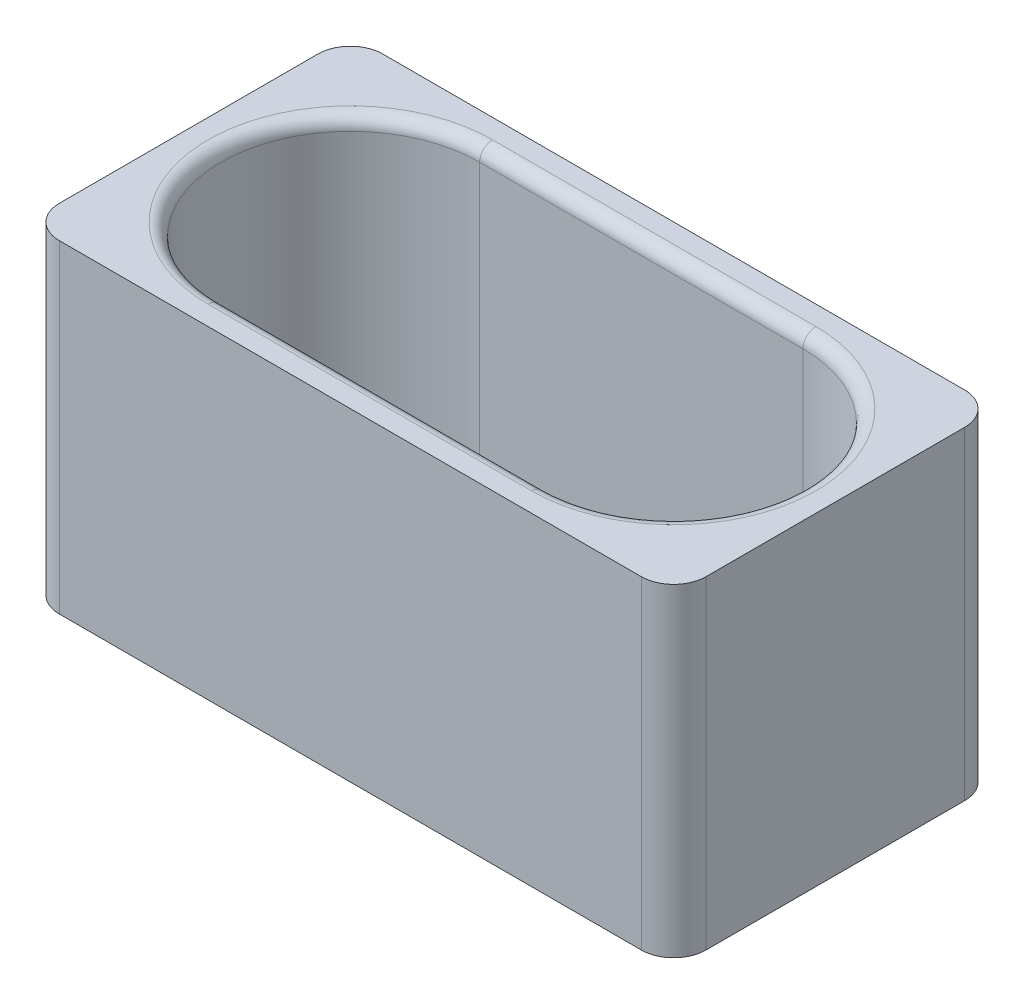
ISO-10303-21;
HEADER;
FILE_DESCRIPTION(('STEP AP214'),'2;1');
FILE_NAME('part.step','',(''),(''),'','','');
FILE_SCHEMA(('AUTOMOTIVE_DESIGN { 1 0 10303 214 1 1 1 1 }'));
ENDSEC;
DATA;
#1=APPLICATION_CONTEXT('core data for automotive mechanical design processes');
#2=APPLICATION_PROTOCOL_DEFINITION('international standard','automotive_design',2000,#1);
#3=PRODUCT_CONTEXT('',#1,'mechanical');
#4=PRODUCT('Part','Part','',(#3));
#5=PRODUCT_RELATED_PRODUCT_CATEGORY('part','',(#4));
#6=PRODUCT_DEFINITION_FORMATION('','',#4);
#7=PRODUCT_DEFINITION_CONTEXT('part definition',#1,'design');
#8=PRODUCT_DEFINITION('design','',#6,#7);
#9=PRODUCT_DEFINITION_SHAPE('','',#8);
#10=(LENGTH_UNIT() NAMED_UNIT(*) SI_UNIT(.MILLI.,.METRE.));
#11=(NAMED_UNIT(*) PLANE_ANGLE_UNIT() SI_UNIT($,.RADIAN.));
#12=(NAMED_UNIT(*) SI_UNIT($,.STERADIAN.) SOLID_ANGLE_UNIT());
#13=UNCERTAINTY_MEASURE_WITH_UNIT(LENGTH_MEASURE(1.E-05),#10,'distance_accuracy_value','');
#14=(GEOMETRIC_REPRESENTATION_CONTEXT(3) GLOBAL_UNCERTAINTY_ASSIGNED_CONTEXT((#13)) GLOBAL_UNIT_ASSIGNED_CONTEXT((#10,
#11,#12)) REPRESENTATION_CONTEXT('',''));
#15=CARTESIAN_POINT('',(0.,0.,0.));
#16=DIRECTION('',(0.,0.,1.));
#17=DIRECTION('',(1.,0.,0.));
#18=AXIS2_PLACEMENT_3D('',#15,#16,#17);
#19=CARTESIAN_POINT('',(50.,50.,25.));
#20=DIRECTION('',(-1.,0.,0.));
#21=DIRECTION('',(0.,0.,1.));
#22=AXIS2_PLACEMENT_3D('',#19,#20,#21);
#23=PLANE('',#22);
#24=DIRECTION('',(0.,0.,-1.));
#25=VECTOR('',#24,1.);
#26=CARTESIAN_POINT('',(50.,0.,25.));
#27=LINE('',#26,#25);
#28=CARTESIAN_POINT('',(50.,0.,20.));
#29=VERTEX_POINT('',#28);
#30=CARTESIAN_POINT('',(50.,0.,-20.));
#31=VERTEX_POINT('',#30);
#32=EDGE_CURVE('E178',#29,#31,#27,.T.);
#33=ORIENTED_EDGE('',*,*,#32,.T.);
#34=DIRECTION('',(0.,-1.,0.));
#35=VECTOR('',#34,1.);
#36=CARTESIAN_POINT('',(50.,50.,-20.));
#37=LINE('',#36,#35);
#38=CARTESIAN_POINT('',(50.,50.,-20.));
#39=VERTEX_POINT('',#38);
#40=EDGE_CURVE('E155',#31,#39,#37,.F.);
#41=ORIENTED_EDGE('',*,*,#40,.T.);
#42=DIRECTION('',(0.,0.,-1.));
#43=VECTOR('',#42,1.);
#44=CARTESIAN_POINT('',(50.,50.,25.));
#45=LINE('',#44,#43);
#46=CARTESIAN_POINT('',(50.,50.,20.));
#47=VERTEX_POINT('',#46);
#48=EDGE_CURVE('E189',#47,#39,#45,.T.);
#49=ORIENTED_EDGE('',*,*,#48,.F.);
#50=DIRECTION('',(0.,-1.,0.));
#51=VECTOR('',#50,1.);
#52=CARTESIAN_POINT('',(50.,50.,20.));
#53=LINE('',#52,#51);
#54=EDGE_CURVE('E160',#47,#29,#53,.T.);
#55=ORIENTED_EDGE('',*,*,#54,.T.);
#56=EDGE_LOOP('',(#33,#41,#49,#55));
#57=FACE_BOUND('',#56,.T.);
#58=ADVANCED_FACE('F34',(#57),#23,.F.);
#59=CARTESIAN_POINT('',(-50.,50.,-25.));
#60=DIRECTION('',(0.,0.,1.));
#61=DIRECTION('',(1.,0.,0.));
#62=AXIS2_PLACEMENT_3D('',#59,#60,#61);
#63=PLANE('',#62);
#64=DIRECTION('',(-1.,0.,0.));
#65=VECTOR('',#64,1.);
#66=CARTESIAN_POINT('',(-50.,50.,-25.));
#67=LINE('',#66,#65);
#68=CARTESIAN_POINT('',(45.,50.,-25.));
#69=VERTEX_POINT('',#68);
#70=CARTESIAN_POINT('',(-45.,50.,-25.));
#71=VERTEX_POINT('',#70);
#72=EDGE_CURVE('E170',#69,#71,#67,.T.);
#73=ORIENTED_EDGE('',*,*,#72,.F.);
#74=DIRECTION('',(0.,-1.,0.));
#75=VECTOR('',#74,1.);
#76=CARTESIAN_POINT('',(45.,50.,-25.));
#77=LINE('',#76,#75);
#78=CARTESIAN_POINT('',(45.,0.,-25.));
#79=VERTEX_POINT('',#78);
#80=EDGE_CURVE('E154',#69,#79,#77,.T.);
#81=ORIENTED_EDGE('',*,*,#80,.T.);
#82=DIRECTION('',(-1.,0.,0.));
#83=VECTOR('',#82,1.);
#84=CARTESIAN_POINT('',(-50.,0.,-25.));
#85=LINE('',#84,#83);
#86=CARTESIAN_POINT('',(-45.,0.,-25.));
#87=VERTEX_POINT('',#86);
#88=EDGE_CURVE('E167',#79,#87,#85,.T.);
#89=ORIENTED_EDGE('',*,*,#88,.T.);
#90=DIRECTION('',(0.,-1.,0.));
#91=VECTOR('',#90,1.);
#92=CARTESIAN_POINT('',(-45.,50.,-25.));
#93=LINE('',#92,#91);
#94=EDGE_CURVE('E172',#87,#71,#93,.F.);
#95=ORIENTED_EDGE('',*,*,#94,.T.);
#96=EDGE_LOOP('',(#73,#81,#89,#95));
#97=FACE_BOUND('',#96,.T.);
#98=ADVANCED_FACE('F166',(#97),#63,.F.);
#99=CARTESIAN_POINT('',(-50.,50.,25.));
#100=DIRECTION('',(1.,0.,0.));
#101=DIRECTION('',(0.,0.,-1.));
#102=AXIS2_PLACEMENT_3D('',#99,#100,#101);
#103=PLANE('',#102);
#104=DIRECTION('',(0.,0.,1.));
#105=VECTOR('',#104,1.);
#106=CARTESIAN_POINT('',(-50.,50.,25.));
#107=LINE('',#106,#105);
#108=CARTESIAN_POINT('',(-50.,50.,-20.));
#109=VERTEX_POINT('',#108);
#110=CARTESIAN_POINT('',(-50.,50.,20.));
#111=VERTEX_POINT('',#110);
#112=EDGE_CURVE('E319',#109,#111,#107,.T.);
#113=ORIENTED_EDGE('',*,*,#112,.F.);
#114=DIRECTION('',(0.,-1.,0.));
#115=VECTOR('',#114,1.);
#116=CARTESIAN_POINT('',(-50.,50.,-20.));
#117=LINE('',#116,#115);
#118=CARTESIAN_POINT('',(-50.,0.,-20.));
#119=VERTEX_POINT('',#118);
#120=EDGE_CURVE('E213',#109,#119,#117,.T.);
#121=ORIENTED_EDGE('',*,*,#120,.T.);
#122=DIRECTION('',(0.,0.,1.));
#123=VECTOR('',#122,1.);
#124=CARTESIAN_POINT('',(-50.,0.,25.));
#125=LINE('',#124,#123);
#126=CARTESIAN_POINT('',(-50.,0.,20.));
#127=VERTEX_POINT('',#126);
#128=EDGE_CURVE('E177',#119,#127,#125,.T.);
#129=ORIENTED_EDGE('',*,*,#128,.T.);
#130=DIRECTION('',(0.,-1.,0.));
#131=VECTOR('',#130,1.);
#132=CARTESIAN_POINT('',(-50.,50.,20.));
#133=LINE('',#132,#131);
#134=EDGE_CURVE('E211',#127,#111,#133,.F.);
#135=ORIENTED_EDGE('',*,*,#134,.T.);
#136=EDGE_LOOP('',(#113,#121,#129,#135));
#137=FACE_BOUND('',#136,.T.);
#138=ADVANCED_FACE('F340',(#137),#103,.F.);
#139=CARTESIAN_POINT('',(-50.,50.,25.));
#140=DIRECTION('',(0.,0.,-1.));
#141=DIRECTION('',(-1.,0.,0.));
#142=AXIS2_PLACEMENT_3D('',#139,#140,#141);
#143=PLANE('',#142);
#144=DIRECTION('',(1.,0.,0.));
#145=VECTOR('',#144,1.);
#146=CARTESIAN_POINT('',(-50.,0.,25.));
#147=LINE('',#146,#145);
#148=CARTESIAN_POINT('',(-45.,0.,25.));
#149=VERTEX_POINT('',#148);
#150=CARTESIAN_POINT('',(45.,0.,25.));
#151=VERTEX_POINT('',#150);
#152=EDGE_CURVE('E181',#149,#151,#147,.T.);
#153=ORIENTED_EDGE('',*,*,#152,.T.);
#154=DIRECTION('',(0.,-1.,0.));
#155=VECTOR('',#154,1.);
#156=CARTESIAN_POINT('',(45.,50.,25.));
#157=LINE('',#156,#155);
#158=CARTESIAN_POINT('',(45.,50.,25.));
#159=VERTEX_POINT('',#158);
#160=EDGE_CURVE('E209',#151,#159,#157,.F.);
#161=ORIENTED_EDGE('',*,*,#160,.T.);
#162=DIRECTION('',(1.,0.,0.));
#163=VECTOR('',#162,1.);
#164=CARTESIAN_POINT('',(-50.,50.,25.));
#165=LINE('',#164,#163);
#166=CARTESIAN_POINT('',(-45.,50.,25.));
#167=VERTEX_POINT('',#166);
#168=EDGE_CURVE('E190',#167,#159,#165,.T.);
#169=ORIENTED_EDGE('',*,*,#168,.F.);
#170=DIRECTION('',(0.,-1.,0.));
#171=VECTOR('',#170,1.);
#172=CARTESIAN_POINT('',(-45.,50.,25.));
#173=LINE('',#172,#171);
#174=EDGE_CURVE('E206',#167,#149,#173,.T.);
#175=ORIENTED_EDGE('',*,*,#174,.T.);
#176=EDGE_LOOP('',(#153,#161,#169,#175));
#177=FACE_BOUND('',#176,.T.);
#178=ADVANCED_FACE('F334',(#177),#143,.F.);
#179=CARTESIAN_POINT('',(0.,50.,0.));
#180=DIRECTION('',(0.,-1.,0.));
#181=DIRECTION('',(0.,0.,-1.));
#182=AXIS2_PLACEMENT_3D('',#179,#180,#181);
#183=PLANE('',#182);
#184=CARTESIAN_POINT('',(-25.,50.,0.));
#185=DIRECTION('',(0.,-1.,0.));
#186=DIRECTION('',(0.,0.,-1.));
#187=AXIS2_PLACEMENT_3D('',#184,#185,#186);
#188=CIRCLE('',#187,22.);
#189=CARTESIAN_POINT('',(-25.,50.,22.));
#190=VERTEX_POINT('',#189);
#191=CARTESIAN_POINT('',(-25.,50.,-22.));
#192=VERTEX_POINT('',#191);
#193=EDGE_CURVE('E251',#190,#192,#188,.T.);
#194=ORIENTED_EDGE('',*,*,#193,.T.);
#195=DIRECTION('',(-1.,0.,0.));
#196=VECTOR('',#195,1.);
#197=CARTESIAN_POINT('',(0.,50.,-22.));
#198=LINE('',#197,#196);
#199=CARTESIAN_POINT('',(25.,50.,-22.));
#200=VERTEX_POINT('',#199);
#201=EDGE_CURVE('E256',#192,#200,#198,.F.);
#202=ORIENTED_EDGE('',*,*,#201,.T.);
#203=CARTESIAN_POINT('',(25.,50.,0.));
#204=DIRECTION('',(0.,-1.,0.));
#205=DIRECTION('',(0.,0.,-1.));
#206=AXIS2_PLACEMENT_3D('',#203,#204,#205);
#207=CIRCLE('',#206,22.);
#208=CARTESIAN_POINT('',(25.,50.,22.));
#209=VERTEX_POINT('',#208);
#210=EDGE_CURVE('E58',#200,#209,#207,.T.);
#211=ORIENTED_EDGE('',*,*,#210,.T.);
#212=DIRECTION('',(1.,0.,0.));
#213=VECTOR('',#212,1.);
#214=CARTESIAN_POINT('',(0.,50.,22.));
#215=LINE('',#214,#213);
#216=EDGE_CURVE('E253',#209,#190,#215,.F.);
#217=ORIENTED_EDGE('',*,*,#216,.T.);
#218=EDGE_LOOP('',(#194,#202,#211,#217));
#219=FACE_BOUND('',#218,.T.);
#220=ORIENTED_EDGE('',*,*,#48,.T.);
#221=CARTESIAN_POINT('',(45.,50.,-20.));
#222=DIRECTION('',(0.,-1.,0.));
#223=DIRECTION('',(0.,0.,-1.));
#224=AXIS2_PLACEMENT_3D('',#221,#222,#223);
#225=CIRCLE('',#224,5.);
#226=EDGE_CURVE('E204',#39,#69,#225,.F.);
#227=ORIENTED_EDGE('',*,*,#226,.T.);
#228=ORIENTED_EDGE('',*,*,#72,.T.);
#229=CARTESIAN_POINT('',(-45.,50.,-20.));
#230=DIRECTION('',(0.,-1.,0.));
#231=DIRECTION('',(0.,0.,-1.));
#232=AXIS2_PLACEMENT_3D('',#229,#230,#231);
#233=CIRCLE('',#232,5.);
#234=EDGE_CURVE('E200',#71,#109,#233,.F.);
#235=ORIENTED_EDGE('',*,*,#234,.T.);
#236=ORIENTED_EDGE('',*,*,#112,.T.);
#237=CARTESIAN_POINT('',(-45.,50.,20.));
#238=DIRECTION('',(0.,-1.,0.));
#239=DIRECTION('',(0.,0.,-1.));
#240=AXIS2_PLACEMENT_3D('',#237,#238,#239);
#241=CIRCLE('',#240,5.);
#242=EDGE_CURVE('E198',#111,#167,#241,.F.);
#243=ORIENTED_EDGE('',*,*,#242,.T.);
#244=ORIENTED_EDGE('',*,*,#168,.T.);
#245=CARTESIAN_POINT('',(45.,50.,20.));
#246=DIRECTION('',(0.,-1.,0.));
#247=DIRECTION('',(0.,0.,-1.));
#248=AXIS2_PLACEMENT_3D('',#245,#246,#247);
#249=CIRCLE('',#248,5.);
#250=EDGE_CURVE('E202',#159,#47,#249,.F.);
#251=ORIENTED_EDGE('',*,*,#250,.T.);
#252=EDGE_LOOP('',(#220,#227,#228,#235,#236,#243,#244,#251));
#253=FACE_BOUND('',#252,.T.);
#254=ADVANCED_FACE('F285',(#219,#253),#183,.F.);
#255=CARTESIAN_POINT('',(0.,0.,0.));
#256=DIRECTION('',(0.,-1.,0.));
#257=DIRECTION('',(0.,0.,-1.));
#258=AXIS2_PLACEMENT_3D('',#255,#256,#257);
#259=PLANE('',#258);
#260=CARTESIAN_POINT('',(25.,0.,0.));
#261=DIRECTION('',(0.,-1.,0.));
#262=DIRECTION('',(0.,0.,-1.));
#263=AXIS2_PLACEMENT_3D('',#260,#261,#262);
#264=CIRCLE('',#263,2.5);
#265=CARTESIAN_POINT('',(25.,0.,-2.5));
#266=VERTEX_POINT('',#265);
#267=EDGE_CURVE('E306',#266,#266,#264,.T.);
#268=ORIENTED_EDGE('',*,*,#267,.F.);
#269=EDGE_LOOP('',(#268));
#270=FACE_BOUND('',#269,.T.);
#271=CARTESIAN_POINT('',(-25.,0.,0.));
#272=DIRECTION('',(0.,-1.,0.));
#273=DIRECTION('',(0.,0.,-1.));
#274=AXIS2_PLACEMENT_3D('',#271,#272,#273);
#275=CIRCLE('',#274,2.5);
#276=CARTESIAN_POINT('',(-25.,0.,-2.5));
#277=VERTEX_POINT('',#276);
#278=EDGE_CURVE('E183',#277,#277,#275,.T.);
#279=ORIENTED_EDGE('',*,*,#278,.F.);
#280=EDGE_LOOP('',(#279));
#281=FACE_BOUND('',#280,.T.);
#282=ORIENTED_EDGE('',*,*,#88,.F.);
#283=CARTESIAN_POINT('',(45.,0.,-20.));
#284=DIRECTION('',(0.,-1.,0.));
#285=DIRECTION('',(0.,0.,-1.));
#286=AXIS2_PLACEMENT_3D('',#283,#284,#285);
#287=CIRCLE('',#286,5.);
#288=EDGE_CURVE('E150',#79,#31,#287,.T.);
#289=ORIENTED_EDGE('',*,*,#288,.T.);
#290=ORIENTED_EDGE('',*,*,#32,.F.);
#291=CARTESIAN_POINT('',(45.,0.,20.));
#292=DIRECTION('',(0.,-1.,0.));
#293=DIRECTION('',(0.,0.,-1.));
#294=AXIS2_PLACEMENT_3D('',#291,#292,#293);
#295=CIRCLE('',#294,5.);
#296=EDGE_CURVE('E161',#29,#151,#295,.T.);
#297=ORIENTED_EDGE('',*,*,#296,.T.);
#298=ORIENTED_EDGE('',*,*,#152,.F.);
#299=CARTESIAN_POINT('',(-45.,0.,20.));
#300=DIRECTION('',(0.,-1.,0.));
#301=DIRECTION('',(0.,0.,-1.));
#302=AXIS2_PLACEMENT_3D('',#299,#300,#301);
#303=CIRCLE('',#302,5.);
#304=EDGE_CURVE('E171',#149,#127,#303,.T.);
#305=ORIENTED_EDGE('',*,*,#304,.T.);
#306=ORIENTED_EDGE('',*,*,#128,.F.);
#307=CARTESIAN_POINT('',(-45.,0.,-20.));
#308=DIRECTION('',(0.,-1.,0.));
#309=DIRECTION('',(0.,0.,-1.));
#310=AXIS2_PLACEMENT_3D('',#307,#308,#309);
#311=CIRCLE('',#310,5.);
#312=EDGE_CURVE('E176',#119,#87,#311,.T.);
#313=ORIENTED_EDGE('',*,*,#312,.T.);
#314=EDGE_LOOP('',(#282,#289,#290,#297,#298,#305,#306,#313));
#315=FACE_BOUND('',#314,.T.);
#316=ADVANCED_FACE('F174',(#270,#281,#315),#259,.T.);
#317=CARTESIAN_POINT('',(45.,50.,-20.));
#318=DIRECTION('',(0.,-1.,0.));
#319=DIRECTION('',(0.,0.,-1.));
#320=AXIS2_PLACEMENT_3D('',#317,#318,#319);
#321=CYLINDRICAL_SURFACE('',#320,5.);
#322=ORIENTED_EDGE('',*,*,#226,.F.);
#323=ORIENTED_EDGE('',*,*,#40,.F.);
#324=ORIENTED_EDGE('',*,*,#288,.F.);
#325=ORIENTED_EDGE('',*,*,#80,.F.);
#326=EDGE_LOOP('',(#322,#323,#324,#325));
#327=FACE_BOUND('',#326,.T.);
#328=ADVANCED_FACE('F153',(#327),#321,.T.);
#329=CARTESIAN_POINT('',(45.,50.,20.));
#330=DIRECTION('',(0.,-1.,0.));
#331=DIRECTION('',(0.,0.,-1.));
#332=AXIS2_PLACEMENT_3D('',#329,#330,#331);
#333=CYLINDRICAL_SURFACE('',#332,5.);
#334=ORIENTED_EDGE('',*,*,#250,.F.);
#335=ORIENTED_EDGE('',*,*,#160,.F.);
#336=ORIENTED_EDGE('',*,*,#296,.F.);
#337=ORIENTED_EDGE('',*,*,#54,.F.);
#338=EDGE_LOOP('',(#334,#335,#336,#337));
#339=FACE_BOUND('',#338,.T.);
#340=ADVANCED_FACE('F331',(#339),#333,.T.);
#341=CARTESIAN_POINT('',(-45.,50.,-20.));
#342=DIRECTION('',(0.,-1.,0.));
#343=DIRECTION('',(0.,0.,-1.));
#344=AXIS2_PLACEMENT_3D('',#341,#342,#343);
#345=CYLINDRICAL_SURFACE('',#344,5.);
#346=ORIENTED_EDGE('',*,*,#234,.F.);
#347=ORIENTED_EDGE('',*,*,#94,.F.);
#348=ORIENTED_EDGE('',*,*,#312,.F.);
#349=ORIENTED_EDGE('',*,*,#120,.F.);
#350=EDGE_LOOP('',(#346,#347,#348,#349));
#351=FACE_BOUND('',#350,.T.);
#352=ADVANCED_FACE('F344',(#351),#345,.T.);
#353=CARTESIAN_POINT('',(-45.,50.,20.));
#354=DIRECTION('',(0.,-1.,0.));
#355=DIRECTION('',(0.,0.,-1.));
#356=AXIS2_PLACEMENT_3D('',#353,#354,#355);
#357=CYLINDRICAL_SURFACE('',#356,5.);
#358=ORIENTED_EDGE('',*,*,#242,.F.);
#359=ORIENTED_EDGE('',*,*,#134,.F.);
#360=ORIENTED_EDGE('',*,*,#304,.F.);
#361=ORIENTED_EDGE('',*,*,#174,.F.);
#362=EDGE_LOOP('',(#358,#359,#360,#361));
#363=FACE_BOUND('',#362,.T.);
#364=ADVANCED_FACE('F336',(#363),#357,.T.);
#365=CARTESIAN_POINT('',(-25.,-5.,0.));
#366=DIRECTION('',(0.,1.,0.));
#367=DIRECTION('',(0.,0.,1.));
#368=AXIS2_PLACEMENT_3D('',#365,#366,#367);
#369=CYLINDRICAL_SURFACE('',#368,2.5);
#370=CARTESIAN_POINT('',(-25.,-3.99999999999999,0.));
#371=DIRECTION('',(0.,-1.,0.));
#372=DIRECTION('',(0.,0.,-1.));
#373=AXIS2_PLACEMENT_3D('',#370,#371,#372);
#374=CIRCLE('',#373,2.5);
#375=CARTESIAN_POINT('',(-25.,-3.99999999999999,-2.5));
#376=VERTEX_POINT('',#375);
#377=EDGE_CURVE('E225',#376,#376,#374,.F.);
#378=ORIENTED_EDGE('',*,*,#377,.T.);
#379=EDGE_LOOP('',(#378));
#380=FACE_BOUND('',#379,.T.);
#381=ORIENTED_EDGE('',*,*,#278,.T.);
#382=EDGE_LOOP('',(#381));
#383=FACE_BOUND('',#382,.T.);
#384=ADVANCED_FACE('F351',(#380,#383),#369,.T.);
#385=CARTESIAN_POINT('',(-25.,-5.,0.));
#386=DIRECTION('',(0.,-1.,0.));
#387=DIRECTION('',(0.,0.,-1.));
#388=AXIS2_PLACEMENT_3D('',#385,#386,#387);
#389=PLANE('',#388);
#390=CARTESIAN_POINT('',(-25.,-5.,0.));
#391=DIRECTION('',(0.,-1.,0.));
#392=DIRECTION('',(0.,0.,-1.));
#393=AXIS2_PLACEMENT_3D('',#390,#391,#392);
#394=CIRCLE('',#393,1.49999999999999);
#395=CARTESIAN_POINT('',(-25.,-5.,-1.49999999999999));
#396=VERTEX_POINT('',#395);
#397=EDGE_CURVE('E222',#396,#396,#394,.T.);
#398=ORIENTED_EDGE('',*,*,#397,.T.);
#399=EDGE_LOOP('',(#398));
#400=FACE_BOUND('',#399,.T.);
#401=ADVANCED_FACE('F535',(#400),#389,.T.);
#402=CARTESIAN_POINT('',(25.,-5.,0.));
#403=DIRECTION('',(0.,1.,0.));
#404=DIRECTION('',(0.,0.,1.));
#405=AXIS2_PLACEMENT_3D('',#402,#403,#404);
#406=CYLINDRICAL_SURFACE('',#405,2.5);
#407=CARTESIAN_POINT('',(25.,-3.99999999999999,0.));
#408=DIRECTION('',(0.,-1.,0.));
#409=DIRECTION('',(0.,0.,-1.));
#410=AXIS2_PLACEMENT_3D('',#407,#408,#409);
#411=CIRCLE('',#410,2.5);
#412=CARTESIAN_POINT('',(25.,-3.99999999999999,-2.5));
#413=VERTEX_POINT('',#412);
#414=EDGE_CURVE('E219',#413,#413,#411,.F.);
#415=ORIENTED_EDGE('',*,*,#414,.T.);
#416=EDGE_LOOP('',(#415));
#417=FACE_BOUND('',#416,.T.);
#418=ORIENTED_EDGE('',*,*,#267,.T.);
#419=EDGE_LOOP('',(#418));
#420=FACE_BOUND('',#419,.T.);
#421=ADVANCED_FACE('F526',(#417,#420),#406,.T.);
#422=CARTESIAN_POINT('',(25.,-5.,0.));
#423=DIRECTION('',(0.,-1.,0.));
#424=DIRECTION('',(0.,0.,-1.));
#425=AXIS2_PLACEMENT_3D('',#422,#423,#424);
#426=PLANE('',#425);
#427=CARTESIAN_POINT('',(25.,-5.,0.));
#428=DIRECTION('',(0.,-1.,0.));
#429=DIRECTION('',(0.,0.,-1.));
#430=AXIS2_PLACEMENT_3D('',#427,#428,#429);
#431=CIRCLE('',#430,1.49999999999999);
#432=CARTESIAN_POINT('',(25.,-5.,-1.49999999999999));
#433=VERTEX_POINT('',#432);
#434=EDGE_CURVE('E216',#433,#433,#431,.T.);
#435=ORIENTED_EDGE('',*,*,#434,.T.);
#436=EDGE_LOOP('',(#435));
#437=FACE_BOUND('',#436,.T.);
#438=ADVANCED_FACE('F522',(#437),#426,.T.);
#439=CARTESIAN_POINT('',(25.,-5.,0.));
#440=DIRECTION('',(0.,1.,0.));
#441=DIRECTION('',(0.,0.,1.));
#442=AXIS2_PLACEMENT_3D('',#439,#440,#441);
#443=CONICAL_SURFACE('',#442,1.49999999999999,0.785398163397451);
#444=ORIENTED_EDGE('',*,*,#414,.F.);
#445=EDGE_LOOP('',(#444));
#446=FACE_BOUND('',#445,.T.);
#447=ORIENTED_EDGE('',*,*,#434,.F.);
#448=EDGE_LOOP('',(#447));
#449=FACE_BOUND('',#448,.T.);
#450=ADVANCED_FACE('F519',(#446,#449),#443,.T.);
#451=CARTESIAN_POINT('',(-25.,-5.,0.));
#452=DIRECTION('',(0.,1.,0.));
#453=DIRECTION('',(0.,0.,1.));
#454=AXIS2_PLACEMENT_3D('',#451,#452,#453);
#455=CONICAL_SURFACE('',#454,1.49999999999999,0.785398163397451);
#456=ORIENTED_EDGE('',*,*,#377,.F.);
#457=EDGE_LOOP('',(#456));
#458=FACE_BOUND('',#457,.T.);
#459=ORIENTED_EDGE('',*,*,#397,.F.);
#460=EDGE_LOOP('',(#459));
#461=FACE_BOUND('',#460,.T.);
#462=ADVANCED_FACE('F397',(#458,#461),#455,.T.);
#463=CARTESIAN_POINT('',(0.,5.,0.));
#464=DIRECTION('',(0.,-1.,0.));
#465=DIRECTION('',(0.,0.,-1.));
#466=AXIS2_PLACEMENT_3D('',#463,#464,#465);
#467=PLANE('',#466);
#468=CARTESIAN_POINT('',(25.,5.,0.));
#469=DIRECTION('',(0.,-1.,0.));
#470=DIRECTION('',(0.,0.,-1.));
#471=AXIS2_PLACEMENT_3D('',#468,#469,#470);
#472=CIRCLE('',#471,18.);
#473=CARTESIAN_POINT('',(25.,5.,18.));
#474=VERTEX_POINT('',#473);
#475=CARTESIAN_POINT('',(25.,5.,-18.));
#476=VERTEX_POINT('',#475);
#477=EDGE_CURVE('E232',#474,#476,#472,.F.);
#478=ORIENTED_EDGE('',*,*,#477,.T.);
#479=DIRECTION('',(-1.,0.,0.));
#480=VECTOR('',#479,1.);
#481=CARTESIAN_POINT('',(-25.,5.,-18.));
#482=LINE('',#481,#480);
#483=CARTESIAN_POINT('',(-25.,5.,-18.));
#484=VERTEX_POINT('',#483);
#485=EDGE_CURVE('E234',#476,#484,#482,.T.);
#486=ORIENTED_EDGE('',*,*,#485,.T.);
#487=CARTESIAN_POINT('',(-25.,5.,0.));
#488=DIRECTION('',(0.,-1.,0.));
#489=DIRECTION('',(0.,0.,-1.));
#490=AXIS2_PLACEMENT_3D('',#487,#488,#489);
#491=CIRCLE('',#490,18.);
#492=CARTESIAN_POINT('',(-25.,5.,18.));
#493=VERTEX_POINT('',#492);
#494=EDGE_CURVE('E228',#484,#493,#491,.F.);
#495=ORIENTED_EDGE('',*,*,#494,.T.);
#496=DIRECTION('',(1.,0.,0.));
#497=VECTOR('',#496,1.);
#498=CARTESIAN_POINT('',(25.,5.,18.));
#499=LINE('',#498,#497);
#500=EDGE_CURVE('E230',#493,#474,#499,.T.);
#501=ORIENTED_EDGE('',*,*,#500,.T.);
#502=EDGE_LOOP('',(#478,#486,#495,#501));
#503=FACE_BOUND('',#502,.T.);
#504=ADVANCED_FACE('F402',(#503),#467,.F.);
#505=CARTESIAN_POINT('',(-25.,-98.488578017961,20.));
#506=DIRECTION('',(0.,0.,1.));
#507=DIRECTION('',(1.,0.,0.));
#508=AXIS2_PLACEMENT_3D('',#505,#506,#507);
#509=PLANE('',#508);
#510=DIRECTION('',(0.,1.,0.));
#511=VECTOR('',#510,1.);
#512=CARTESIAN_POINT('',(25.,-98.488578017961,20.));
#513=LINE('',#512,#511);
#514=CARTESIAN_POINT('',(25.,7.00000000000001,20.));
#515=VERTEX_POINT('',#514);
#516=CARTESIAN_POINT('',(25.,48.,20.));
#517=VERTEX_POINT('',#516);
#518=EDGE_CURVE('E269',#515,#517,#513,.T.);
#519=ORIENTED_EDGE('',*,*,#518,.F.);
#520=DIRECTION('',(1.,0.,0.));
#521=VECTOR('',#520,1.);
#522=CARTESIAN_POINT('',(-25.,7.,20.));
#523=LINE('',#522,#521);
#524=CARTESIAN_POINT('',(-25.,7.00000000000001,20.));
#525=VERTEX_POINT('',#524);
#526=EDGE_CURVE('E249',#515,#525,#523,.F.);
#527=ORIENTED_EDGE('',*,*,#526,.T.);
#528=DIRECTION('',(0.,1.,0.));
#529=VECTOR('',#528,1.);
#530=CARTESIAN_POINT('',(-25.,-98.488578017961,20.));
#531=LINE('',#530,#529);
#532=CARTESIAN_POINT('',(-25.,48.,20.));
#533=VERTEX_POINT('',#532);
#534=EDGE_CURVE('E304',#525,#533,#531,.T.);
#535=ORIENTED_EDGE('',*,*,#534,.T.);
#536=DIRECTION('',(1.,0.,0.));
#537=VECTOR('',#536,1.);
#538=CARTESIAN_POINT('',(-25.,48.,20.));
#539=LINE('',#538,#537);
#540=EDGE_CURVE('E247',#533,#517,#539,.T.);
#541=ORIENTED_EDGE('',*,*,#540,.T.);
#542=EDGE_LOOP('',(#519,#527,#535,#541));
#543=FACE_BOUND('',#542,.T.);
#544=ADVANCED_FACE('F407',(#543),#509,.F.);
#545=CARTESIAN_POINT('',(25.,-98.488578017961,0.));
#546=DIRECTION('',(0.,1.,0.));
#547=DIRECTION('',(0.,0.,1.));
#548=AXIS2_PLACEMENT_3D('',#545,#546,#547);
#549=CYLINDRICAL_SURFACE('',#548,20.);
#550=DIRECTION('',(0.,1.,0.));
#551=VECTOR('',#550,1.);
#552=CARTESIAN_POINT('',(25.,-98.488578017961,-20.));
#553=LINE('',#552,#551);
#554=CARTESIAN_POINT('',(25.,7.00000000000001,-20.));
#555=VERTEX_POINT('',#554);
#556=CARTESIAN_POINT('',(25.,48.,-20.));
#557=VERTEX_POINT('',#556);
#558=EDGE_CURVE('E301',#555,#557,#553,.T.);
#559=ORIENTED_EDGE('',*,*,#558,.F.);
#560=CARTESIAN_POINT('',(25.,7.00000000000001,0.));
#561=DIRECTION('',(0.,-1.,0.));
#562=DIRECTION('',(0.,0.,-1.));
#563=AXIS2_PLACEMENT_3D('',#560,#561,#562);
#564=CIRCLE('',#563,20.);
#565=EDGE_CURVE('E245',#555,#515,#564,.T.);
#566=ORIENTED_EDGE('',*,*,#565,.T.);
#567=ORIENTED_EDGE('',*,*,#518,.T.);
#568=CARTESIAN_POINT('',(25.,48.,0.));
#569=DIRECTION('',(0.,-1.,0.));
#570=DIRECTION('',(0.,0.,-1.));
#571=AXIS2_PLACEMENT_3D('',#568,#569,#570);
#572=CIRCLE('',#571,20.);
#573=EDGE_CURVE('E243',#517,#557,#572,.F.);
#574=ORIENTED_EDGE('',*,*,#573,.T.);
#575=EDGE_LOOP('',(#559,#566,#567,#574));
#576=FACE_BOUND('',#575,.T.);
#577=ADVANCED_FACE('F417',(#576),#549,.F.);
#578=CARTESIAN_POINT('',(-25.,-98.488578017961,-20.));
#579=DIRECTION('',(0.,0.,-1.));
#580=DIRECTION('',(-1.,0.,0.));
#581=AXIS2_PLACEMENT_3D('',#578,#579,#580);
#582=PLANE('',#581);
#583=DIRECTION('',(0.,1.,0.));
#584=VECTOR('',#583,1.);
#585=CARTESIAN_POINT('',(-25.,-98.488578017961,-20.));
#586=LINE('',#585,#584);
#587=CARTESIAN_POINT('',(-25.,7.00000000000001,-20.));
#588=VERTEX_POINT('',#587);
#589=CARTESIAN_POINT('',(-25.,48.,-20.));
#590=VERTEX_POINT('',#589);
#591=EDGE_CURVE('E298',#588,#590,#586,.T.);
#592=ORIENTED_EDGE('',*,*,#591,.F.);
#593=DIRECTION('',(-1.,0.,0.));
#594=VECTOR('',#593,1.);
#595=CARTESIAN_POINT('',(25.,7.,-20.));
#596=LINE('',#595,#594);
#597=EDGE_CURVE('E240',#588,#555,#596,.F.);
#598=ORIENTED_EDGE('',*,*,#597,.T.);
#599=ORIENTED_EDGE('',*,*,#558,.T.);
#600=DIRECTION('',(-1.,0.,0.));
#601=VECTOR('',#600,1.);
#602=CARTESIAN_POINT('',(-25.,48.,-20.));
#603=LINE('',#602,#601);
#604=EDGE_CURVE('E237',#557,#590,#603,.T.);
#605=ORIENTED_EDGE('',*,*,#604,.T.);
#606=EDGE_LOOP('',(#592,#598,#599,#605));
#607=FACE_BOUND('',#606,.T.);
#608=ADVANCED_FACE('F297',(#607),#582,.F.);
#609=CARTESIAN_POINT('',(-25.,-98.488578017961,0.));
#610=DIRECTION('',(0.,1.,0.));
#611=DIRECTION('',(0.,0.,1.));
#612=AXIS2_PLACEMENT_3D('',#609,#610,#611);
#613=CYLINDRICAL_SURFACE('',#612,20.);
#614=ORIENTED_EDGE('',*,*,#534,.F.);
#615=CARTESIAN_POINT('',(-25.,7.00000000000001,0.));
#616=DIRECTION('',(0.,-1.,0.));
#617=DIRECTION('',(0.,0.,-1.));
#618=AXIS2_PLACEMENT_3D('',#615,#616,#617);
#619=CIRCLE('',#618,20.);
#620=EDGE_CURVE('E12',#525,#588,#619,.T.);
#621=ORIENTED_EDGE('',*,*,#620,.T.);
#622=ORIENTED_EDGE('',*,*,#591,.T.);
#623=CARTESIAN_POINT('',(-25.,48.,0.));
#624=DIRECTION('',(0.,-1.,0.));
#625=DIRECTION('',(0.,0.,-1.));
#626=AXIS2_PLACEMENT_3D('',#623,#624,#625);
#627=CIRCLE('',#626,20.);
#628=EDGE_CURVE('E43',#590,#533,#627,.F.);
#629=ORIENTED_EDGE('',*,*,#628,.T.);
#630=EDGE_LOOP('',(#614,#621,#622,#629));
#631=FACE_BOUND('',#630,.T.);
#632=ADVANCED_FACE('F302',(#631),#613,.F.);
#633=CARTESIAN_POINT('',(0.,7.,18.));
#634=DIRECTION('',(-1.,0.,0.));
#635=DIRECTION('',(0.,0.,1.));
#636=AXIS2_PLACEMENT_3D('',#633,#634,#635);
#637=CYLINDRICAL_SURFACE('',#636,2.);
#638=CARTESIAN_POINT('',(-25.,7.,18.));
#639=DIRECTION('',(1.,0.,0.));
#640=DIRECTION('',(0.,0.,-1.));
#641=AXIS2_PLACEMENT_3D('',#638,#639,#640);
#642=CIRCLE('',#641,2.);
#643=EDGE_CURVE('E263',#525,#493,#642,.T.);
#644=ORIENTED_EDGE('',*,*,#643,.F.);
#645=ORIENTED_EDGE('',*,*,#526,.F.);
#646=CARTESIAN_POINT('',(25.,7.,18.));
#647=DIRECTION('',(-1.,0.,0.));
#648=DIRECTION('',(0.,0.,1.));
#649=AXIS2_PLACEMENT_3D('',#646,#647,#648);
#650=CIRCLE('',#649,2.);
#651=EDGE_CURVE('E266',#474,#515,#650,.T.);
#652=ORIENTED_EDGE('',*,*,#651,.F.);
#653=ORIENTED_EDGE('',*,*,#500,.F.);
#654=EDGE_LOOP('',(#644,#645,#652,#653));
#655=FACE_BOUND('',#654,.T.);
#656=ADVANCED_FACE('F444',(#655),#637,.F.);
#657=CARTESIAN_POINT('',(25.,7.00000000000001,0.));
#658=DIRECTION('',(0.,-1.,0.));
#659=DIRECTION('',(0.,0.,-1.));
#660=AXIS2_PLACEMENT_3D('',#657,#658,#659);
#661=TOROIDAL_SURFACE('',#660,18.,2.);
#662=ORIENTED_EDGE('',*,*,#651,.T.);
#663=ORIENTED_EDGE('',*,*,#565,.F.);
#664=CARTESIAN_POINT('',(25.,7.,-18.));
#665=DIRECTION('',(1.,0.,0.));
#666=DIRECTION('',(0.,0.,-1.));
#667=AXIS2_PLACEMENT_3D('',#664,#665,#666);
#668=CIRCLE('',#667,2.);
#669=EDGE_CURVE('E261',#476,#555,#668,.T.);
#670=ORIENTED_EDGE('',*,*,#669,.F.);
#671=ORIENTED_EDGE('',*,*,#477,.F.);
#672=EDGE_LOOP('',(#662,#663,#670,#671));
#673=FACE_BOUND('',#672,.T.);
#674=ADVANCED_FACE('F453',(#673),#661,.F.);
#675=CARTESIAN_POINT('',(-25.,7.00000000000001,0.));
#676=DIRECTION('',(0.,-1.,0.));
#677=DIRECTION('',(0.,0.,-1.));
#678=AXIS2_PLACEMENT_3D('',#675,#676,#677);
#679=TOROIDAL_SURFACE('',#678,18.,2.);
#680=ORIENTED_EDGE('',*,*,#643,.T.);
#681=ORIENTED_EDGE('',*,*,#494,.F.);
#682=CARTESIAN_POINT('',(-25.,7.00000000000001,-18.));
#683=DIRECTION('',(-1.,0.,0.));
#684=DIRECTION('',(0.,0.,1.));
#685=AXIS2_PLACEMENT_3D('',#682,#683,#684);
#686=CIRCLE('',#685,2.);
#687=EDGE_CURVE('E259',#588,#484,#686,.T.);
#688=ORIENTED_EDGE('',*,*,#687,.F.);
#689=ORIENTED_EDGE('',*,*,#620,.F.);
#690=EDGE_LOOP('',(#680,#681,#688,#689));
#691=FACE_BOUND('',#690,.T.);
#692=ADVANCED_FACE('F463',(#691),#679,.F.);
#693=CARTESIAN_POINT('',(0.,7.,-18.));
#694=DIRECTION('',(1.,0.,0.));
#695=DIRECTION('',(0.,0.,-1.));
#696=AXIS2_PLACEMENT_3D('',#693,#694,#695);
#697=CYLINDRICAL_SURFACE('',#696,2.);
#698=ORIENTED_EDGE('',*,*,#669,.T.);
#699=ORIENTED_EDGE('',*,*,#597,.F.);
#700=ORIENTED_EDGE('',*,*,#687,.T.);
#701=ORIENTED_EDGE('',*,*,#485,.F.);
#702=EDGE_LOOP('',(#698,#699,#700,#701));
#703=FACE_BOUND('',#702,.T.);
#704=ADVANCED_FACE('F473',(#703),#697,.F.);
#705=CARTESIAN_POINT('',(-25.,48.,22.));
#706=DIRECTION('',(1.,0.,0.));
#707=DIRECTION('',(0.,0.,-1.));
#708=AXIS2_PLACEMENT_3D('',#705,#706,#707);
#709=CYLINDRICAL_SURFACE('',#708,2.);
#710=CARTESIAN_POINT('',(-25.,48.,22.));
#711=DIRECTION('',(-1.,0.,0.));
#712=DIRECTION('',(0.,0.,1.));
#713=AXIS2_PLACEMENT_3D('',#710,#711,#712);
#714=CIRCLE('',#713,2.);
#715=EDGE_CURVE('E272',#190,#533,#714,.T.);
#716=ORIENTED_EDGE('',*,*,#715,.F.);
#717=ORIENTED_EDGE('',*,*,#216,.F.);
#718=CARTESIAN_POINT('',(25.,48.,22.));
#719=DIRECTION('',(1.,0.,0.));
#720=DIRECTION('',(0.,0.,-1.));
#721=AXIS2_PLACEMENT_3D('',#718,#719,#720);
#722=CIRCLE('',#721,2.);
#723=EDGE_CURVE('E38',#517,#209,#722,.T.);
#724=ORIENTED_EDGE('',*,*,#723,.F.);
#725=ORIENTED_EDGE('',*,*,#540,.F.);
#726=EDGE_LOOP('',(#716,#717,#724,#725));
#727=FACE_BOUND('',#726,.T.);
#728=ADVANCED_FACE('F36',(#727),#709,.T.);
#729=CARTESIAN_POINT('',(25.,48.,0.));
#730=DIRECTION('',(0.,-1.,0.));
#731=DIRECTION('',(0.,0.,-1.));
#732=AXIS2_PLACEMENT_3D('',#729,#730,#731);
#733=TOROIDAL_SURFACE('',#732,22.,2.);
#734=ORIENTED_EDGE('',*,*,#723,.T.);
#735=ORIENTED_EDGE('',*,*,#210,.F.);
#736=CARTESIAN_POINT('',(25.,48.,-22.));
#737=DIRECTION('',(-1.,0.,0.));
#738=DIRECTION('',(0.,0.,1.));
#739=AXIS2_PLACEMENT_3D('',#736,#737,#738);
#740=CIRCLE('',#739,2.);
#741=EDGE_CURVE('E51',#557,#200,#740,.T.);
#742=ORIENTED_EDGE('',*,*,#741,.F.);
#743=ORIENTED_EDGE('',*,*,#573,.F.);
#744=EDGE_LOOP('',(#734,#735,#742,#743));
#745=FACE_BOUND('',#744,.T.);
#746=ADVANCED_FACE('F282',(#745),#733,.T.);
#747=CARTESIAN_POINT('',(-25.,48.,0.));
#748=DIRECTION('',(0.,-1.,0.));
#749=DIRECTION('',(0.,0.,-1.));
#750=AXIS2_PLACEMENT_3D('',#747,#748,#749);
#751=TOROIDAL_SURFACE('',#750,22.,2.);
#752=ORIENTED_EDGE('',*,*,#715,.T.);
#753=ORIENTED_EDGE('',*,*,#628,.F.);
#754=CARTESIAN_POINT('',(-25.,48.,-22.));
#755=DIRECTION('',(1.,0.,0.));
#756=DIRECTION('',(0.,0.,-1.));
#757=AXIS2_PLACEMENT_3D('',#754,#755,#756);
#758=CIRCLE('',#757,2.);
#759=EDGE_CURVE('E270',#192,#590,#758,.T.);
#760=ORIENTED_EDGE('',*,*,#759,.F.);
#761=ORIENTED_EDGE('',*,*,#193,.F.);
#762=EDGE_LOOP('',(#752,#753,#760,#761));
#763=FACE_BOUND('',#762,.T.);
#764=ADVANCED_FACE('F289',(#763),#751,.T.);
#765=CARTESIAN_POINT('',(-25.,48.,-22.));
#766=DIRECTION('',(-1.,0.,0.));
#767=DIRECTION('',(0.,0.,1.));
#768=AXIS2_PLACEMENT_3D('',#765,#766,#767);
#769=CYLINDRICAL_SURFACE('',#768,2.);
#770=ORIENTED_EDGE('',*,*,#741,.T.);
#771=ORIENTED_EDGE('',*,*,#201,.F.);
#772=ORIENTED_EDGE('',*,*,#759,.T.);
#773=ORIENTED_EDGE('',*,*,#604,.F.);
#774=EDGE_LOOP('',(#770,#771,#772,#773));
#775=FACE_BOUND('',#774,.T.);
#776=ADVANCED_FACE('F288',(#775),#769,.T.);
#777=CLOSED_SHELL('',(#58,#98,#138,#178,#254,#316,#328,#340,#352,#364,#384,#401,#421,#438,#450,
#462,#504,#544,#577,#608,#632,#656,#674,#692,#704,#728,#746,#764,#776));
#778=MANIFOLD_SOLID_BREP('B2',#777);
#779=ADVANCED_BREP_SHAPE_REPRESENTATION('',(#18,#778),#14);
#780=SHAPE_DEFINITION_REPRESENTATION(#9,#779);
ENDSEC;
END-ISO-10303-21;
